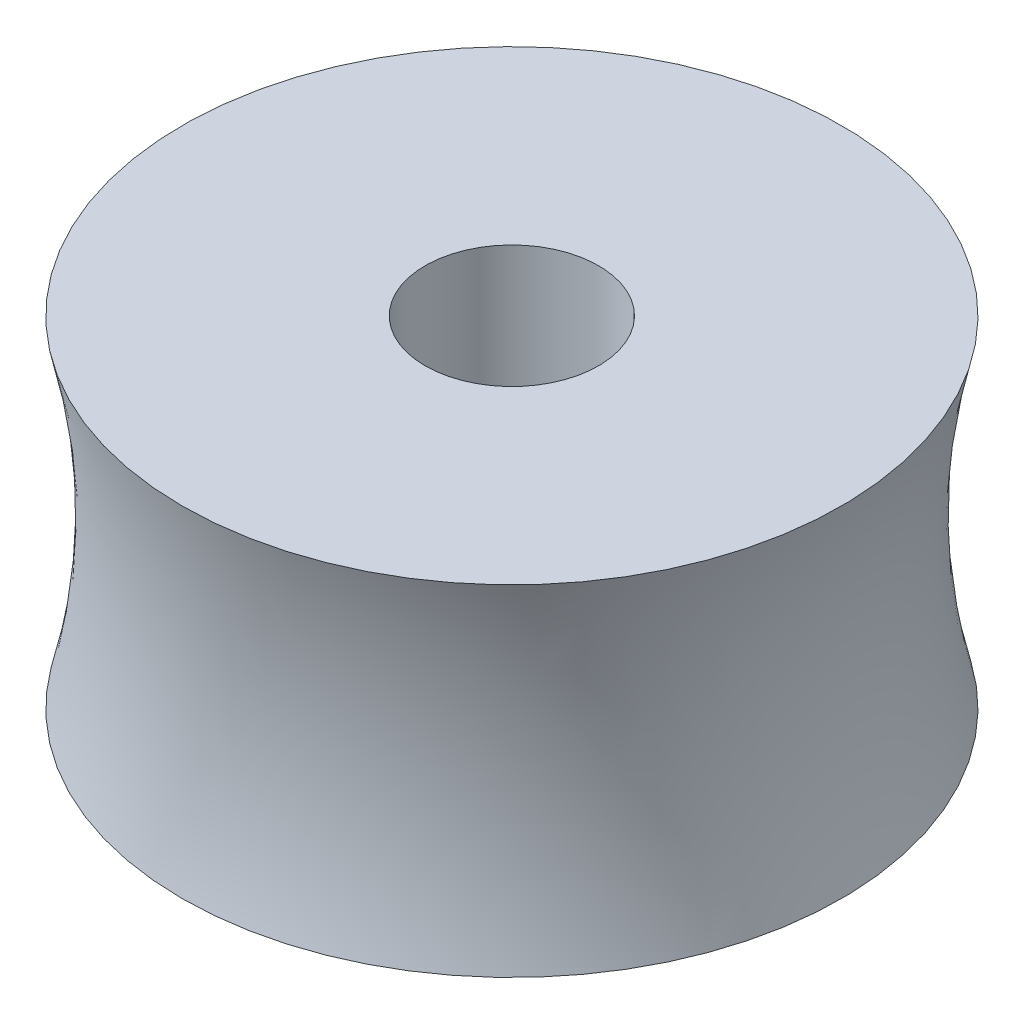
ISO-10303-21;
HEADER;
FILE_DESCRIPTION(('STEP AP214'),'2;1');
FILE_NAME('part.step','',(''),(''),'','','');
FILE_SCHEMA(('AUTOMOTIVE_DESIGN { 1 0 10303 214 1 1 1 1 }'));
ENDSEC;
DATA;
#1=APPLICATION_CONTEXT('core data for automotive mechanical design processes');
#2=APPLICATION_PROTOCOL_DEFINITION('international standard','automotive_design',2000,#1);
#3=PRODUCT_CONTEXT('',#1,'mechanical');
#4=PRODUCT('Part','Part','',(#3));
#5=PRODUCT_RELATED_PRODUCT_CATEGORY('part','',(#4));
#6=PRODUCT_DEFINITION_FORMATION('','',#4);
#7=PRODUCT_DEFINITION_CONTEXT('part definition',#1,'design');
#8=PRODUCT_DEFINITION('design','',#6,#7);
#9=PRODUCT_DEFINITION_SHAPE('','',#8);
#10=(LENGTH_UNIT() NAMED_UNIT(*) SI_UNIT(.MILLI.,.METRE.));
#11=(NAMED_UNIT(*) PLANE_ANGLE_UNIT() SI_UNIT($,.RADIAN.));
#12=(NAMED_UNIT(*) SI_UNIT($,.STERADIAN.) SOLID_ANGLE_UNIT());
#13=UNCERTAINTY_MEASURE_WITH_UNIT(LENGTH_MEASURE(1.E-05),#10,'distance_accuracy_value','');
#14=(GEOMETRIC_REPRESENTATION_CONTEXT(3) GLOBAL_UNCERTAINTY_ASSIGNED_CONTEXT((#13)) GLOBAL_UNIT_ASSIGNED_CONTEXT((#10,
#11,#12)) REPRESENTATION_CONTEXT('',''));
#15=CARTESIAN_POINT('',(0.,0.,0.));
#16=DIRECTION('',(0.,0.,1.));
#17=DIRECTION('',(1.,0.,0.));
#18=AXIS2_PLACEMENT_3D('',#15,#16,#17);
#19=CARTESIAN_POINT('',(0.,0.,-9.5));
#20=DIRECTION('',(0.,-1.,0.));
#21=DIRECTION('',(0.,0.,-1.));
#22=AXIS2_PLACEMENT_3D('',#19,#20,#21);
#23=PLANE('',#22);
#24=CARTESIAN_POINT('',(0.,0.,0.));
#25=DIRECTION('',(0.,1.,0.));
#26=DIRECTION('',(0.,0.,1.));
#27=AXIS2_PLACEMENT_3D('',#24,#25,#26);
#28=CIRCLE('',#27,2.5);
#29=CARTESIAN_POINT('',(0.,0.,2.5));
#30=VERTEX_POINT('',#29);
#31=EDGE_CURVE('E10',#30,#30,#28,.T.);
#32=ORIENTED_EDGE('',*,*,#31,.F.);
#33=EDGE_LOOP('',(#32));
#34=FACE_BOUND('',#33,.T.);
#35=CARTESIAN_POINT('',(0.,0.,0.));
#36=DIRECTION('',(0.,1.,0.));
#37=DIRECTION('',(0.,0.,1.));
#38=AXIS2_PLACEMENT_3D('',#35,#36,#37);
#39=CIRCLE('',#38,9.5);
#40=CARTESIAN_POINT('',(0.,0.,9.5));
#41=VERTEX_POINT('',#40);
#42=EDGE_CURVE('E58',#41,#41,#39,.T.);
#43=ORIENTED_EDGE('',*,*,#42,.T.);
#44=EDGE_LOOP('',(#43));
#45=FACE_BOUND('',#44,.T.);
#46=ADVANCED_FACE('F41',(#34,#45),#23,.F.);
#47=CARTESIAN_POINT('',(0.,0.,0.));
#48=DIRECTION('',(0.,1.,0.));
#49=DIRECTION('',(0.,0.,1.));
#50=AXIS2_PLACEMENT_3D('',#47,#48,#49);
#51=CYLINDRICAL_SURFACE('',#50,2.5);
#52=CARTESIAN_POINT('',(0.,-9.8,0.));
#53=DIRECTION('',(0.,1.,0.));
#54=DIRECTION('',(0.,0.,1.));
#55=AXIS2_PLACEMENT_3D('',#52,#53,#54);
#56=CIRCLE('',#55,2.5);
#57=CARTESIAN_POINT('',(0.,-9.8,2.5));
#58=VERTEX_POINT('',#57);
#59=EDGE_CURVE('E48',#58,#58,#56,.T.);
#60=ORIENTED_EDGE('',*,*,#59,.F.);
#61=EDGE_LOOP('',(#60));
#62=FACE_BOUND('',#61,.T.);
#63=ORIENTED_EDGE('',*,*,#31,.T.);
#64=EDGE_LOOP('',(#63));
#65=FACE_BOUND('',#64,.T.);
#66=ADVANCED_FACE('F74',(#62,#65),#51,.F.);
#67=CARTESIAN_POINT('',(0.,-9.8,-2.5));
#68=DIRECTION('',(0.,1.,0.));
#69=DIRECTION('',(0.,0.,1.));
#70=AXIS2_PLACEMENT_3D('',#67,#68,#69);
#71=PLANE('',#70);
#72=CARTESIAN_POINT('',(0.,-9.8,0.));
#73=DIRECTION('',(0.,1.,0.));
#74=DIRECTION('',(0.,0.,1.));
#75=AXIS2_PLACEMENT_3D('',#72,#73,#74);
#76=CIRCLE('',#75,9.5);
#77=CARTESIAN_POINT('',(0.,-9.8,9.5));
#78=VERTEX_POINT('',#77);
#79=EDGE_CURVE('E53',#78,#78,#76,.T.);
#80=ORIENTED_EDGE('',*,*,#79,.F.);
#81=EDGE_LOOP('',(#80));
#82=FACE_BOUND('',#81,.T.);
#83=ORIENTED_EDGE('',*,*,#59,.T.);
#84=EDGE_LOOP('',(#83));
#85=FACE_BOUND('',#84,.T.);
#86=ADVANCED_FACE('F69',(#82,#85),#71,.F.);
#87=CARTESIAN_POINT('',(0.,-4.9,0.));
#88=DIRECTION('',(0.,1.,0.));
#89=DIRECTION('',(0.,0.,1.));
#90=AXIS2_PLACEMENT_3D('',#87,#88,#89);
#91=TOROIDAL_SURFACE('',#90,28.8904615726393,20.);
#92=ORIENTED_EDGE('',*,*,#42,.F.);
#93=EDGE_LOOP('',(#92));
#94=FACE_BOUND('',#93,.T.);
#95=ORIENTED_EDGE('',*,*,#79,.T.);
#96=EDGE_LOOP('',(#95));
#97=FACE_BOUND('',#96,.T.);
#98=ADVANCED_FACE('F66',(#94,#97),#91,.F.);
#99=CLOSED_SHELL('',(#46,#66,#86,#98));
#100=MANIFOLD_SOLID_BREP('B2',#99);
#101=ADVANCED_BREP_SHAPE_REPRESENTATION('',(#18,#100),#14);
#102=SHAPE_DEFINITION_REPRESENTATION(#9,#101);
ENDSEC;
END-ISO-10303-21;
